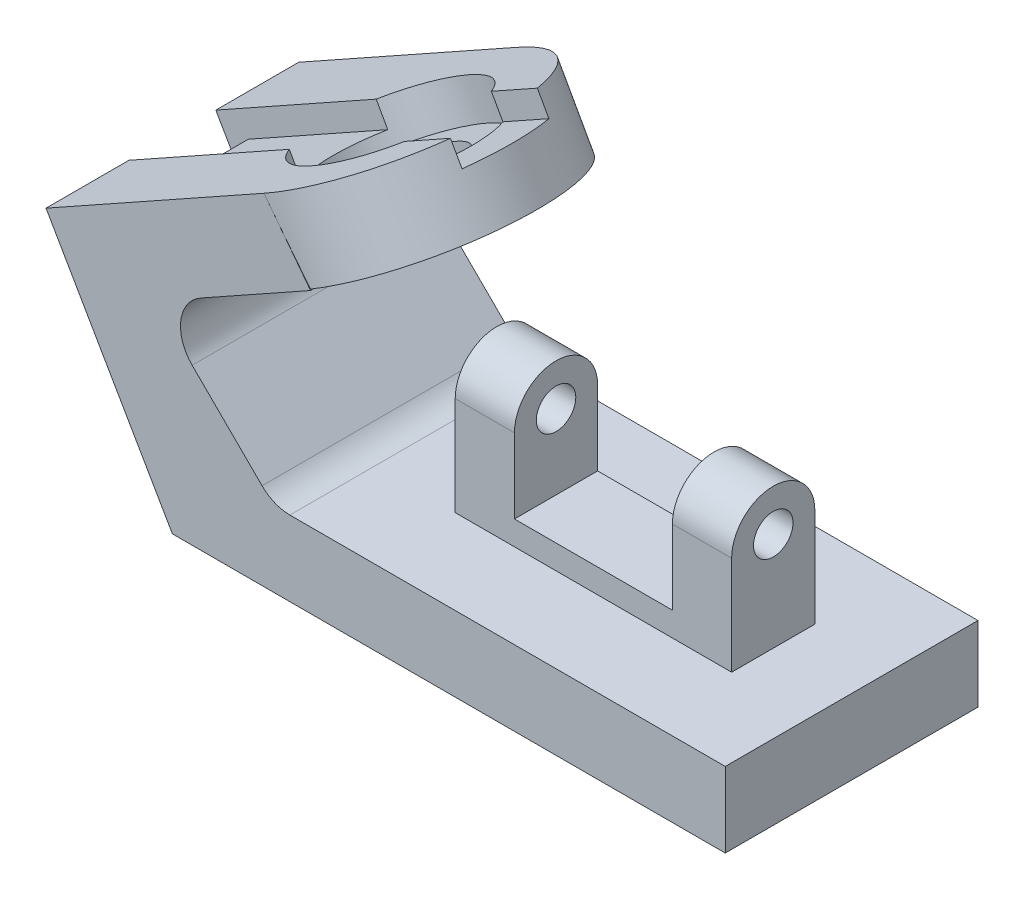
ISO-10303-21;
HEADER;
FILE_DESCRIPTION(('STEP AP214'),'2;1');
FILE_NAME('part.step','',(''),(''),'','','');
FILE_SCHEMA(('AUTOMOTIVE_DESIGN { 1 0 10303 214 1 1 1 1 }'));
ENDSEC;
DATA;
#1=APPLICATION_CONTEXT('core data for automotive mechanical design processes');
#2=APPLICATION_PROTOCOL_DEFINITION('international standard','automotive_design',2000,#1);
#3=PRODUCT_CONTEXT('',#1,'mechanical');
#4=PRODUCT('Part','Part','',(#3));
#5=PRODUCT_RELATED_PRODUCT_CATEGORY('part','',(#4));
#6=PRODUCT_DEFINITION_FORMATION('','',#4);
#7=PRODUCT_DEFINITION_CONTEXT('part definition',#1,'design');
#8=PRODUCT_DEFINITION('design','',#6,#7);
#9=PRODUCT_DEFINITION_SHAPE('','',#8);
#10=(LENGTH_UNIT() NAMED_UNIT(*) SI_UNIT(.MILLI.,.METRE.));
#11=(NAMED_UNIT(*) PLANE_ANGLE_UNIT() SI_UNIT($,.RADIAN.));
#12=(NAMED_UNIT(*) SI_UNIT($,.STERADIAN.) SOLID_ANGLE_UNIT());
#13=UNCERTAINTY_MEASURE_WITH_UNIT(LENGTH_MEASURE(1.E-05),#10,'distance_accuracy_value','');
#14=(GEOMETRIC_REPRESENTATION_CONTEXT(3) GLOBAL_UNCERTAINTY_ASSIGNED_CONTEXT((#13)) GLOBAL_UNIT_ASSIGNED_CONTEXT((#10,
#11,#12)) REPRESENTATION_CONTEXT('',''));
#15=CARTESIAN_POINT('',(0.,0.,0.));
#16=DIRECTION('',(0.,0.,1.));
#17=DIRECTION('',(1.,0.,0.));
#18=AXIS2_PLACEMENT_3D('',#15,#16,#17);
#19=CARTESIAN_POINT('',(50.1525287476843,44.,0.));
#20=DIRECTION('',(1.,0.,0.));
#21=DIRECTION('',(0.,1.,0.));
#22=AXIS2_PLACEMENT_3D('',#19,#20,#21);
#23=CYLINDRICAL_SURFACE('',#22,10.5347427146737);
#24=DIRECTION('',(-1.,0.,0.));
#25=VECTOR('',#24,1.);
#26=CARTESIAN_POINT('',(50.1525287476843,44.,-10.5347427146737));
#27=LINE('',#26,#25);
#28=CARTESIAN_POINT('',(120.152528747684,44.,-10.5347427146737));
#29=VERTEX_POINT('',#28);
#30=CARTESIAN_POINT('',(105.152528747684,44.,-10.5347427146737));
#31=VERTEX_POINT('',#30);
#32=EDGE_CURVE('E290',#29,#31,#27,.T.);
#33=ORIENTED_EDGE('',*,*,#32,.T.);
#34=CARTESIAN_POINT('',(105.152528747684,44.,0.));
#35=DIRECTION('',(1.,0.,0.));
#36=DIRECTION('',(0.,1.,0.));
#37=AXIS2_PLACEMENT_3D('',#34,#35,#36);
#38=CIRCLE('',#37,10.5347427146737);
#39=CARTESIAN_POINT('',(105.152528747684,44.,10.5347427146737));
#40=VERTEX_POINT('',#39);
#41=EDGE_CURVE('E270',#31,#40,#38,.T.);
#42=ORIENTED_EDGE('',*,*,#41,.T.);
#43=DIRECTION('',(1.,0.,0.));
#44=VECTOR('',#43,1.);
#45=CARTESIAN_POINT('',(50.1525287476843,44.,10.5347427146737));
#46=LINE('',#45,#44);
#47=CARTESIAN_POINT('',(120.152528747684,44.,10.5347427146737));
#48=VERTEX_POINT('',#47);
#49=EDGE_CURVE('E293',#40,#48,#46,.T.);
#50=ORIENTED_EDGE('',*,*,#49,.T.);
#51=CARTESIAN_POINT('',(120.152528747684,44.,0.));
#52=DIRECTION('',(1.,0.,0.));
#53=DIRECTION('',(0.,0.,-1.));
#54=AXIS2_PLACEMENT_3D('',#51,#52,#53);
#55=CIRCLE('',#54,10.5347427146737);
#56=EDGE_CURVE('E281',#48,#29,#55,.F.);
#57=ORIENTED_EDGE('',*,*,#56,.T.);
#58=EDGE_LOOP('',(#33,#42,#50,#57));
#59=FACE_BOUND('',#58,.T.);
#60=ADVANCED_FACE('F43',(#59),#23,.T.);
#61=CARTESIAN_POINT('',(50.1525287476843,44.,0.));
#62=DIRECTION('',(1.,0.,0.));
#63=DIRECTION('',(0.,1.,0.));
#64=AXIS2_PLACEMENT_3D('',#61,#62,#63);
#65=CYLINDRICAL_SURFACE('',#64,5.);
#66=CARTESIAN_POINT('',(105.152528747684,44.,0.));
#67=DIRECTION('',(1.,0.,0.));
#68=DIRECTION('',(0.,1.,0.));
#69=AXIS2_PLACEMENT_3D('',#66,#67,#68);
#70=CIRCLE('',#69,5.);
#71=CARTESIAN_POINT('',(105.152528747684,49.,0.));
#72=VERTEX_POINT('',#71);
#73=EDGE_CURVE('E47',#72,#72,#70,.F.);
#74=ORIENTED_EDGE('',*,*,#73,.T.);
#75=EDGE_LOOP('',(#74));
#76=FACE_BOUND('',#75,.T.);
#77=CARTESIAN_POINT('',(120.152528747684,44.,0.));
#78=DIRECTION('',(1.,0.,0.));
#79=DIRECTION('',(0.,1.,0.));
#80=AXIS2_PLACEMENT_3D('',#77,#78,#79);
#81=CIRCLE('',#80,5.);
#82=CARTESIAN_POINT('',(120.152528747684,49.,0.));
#83=VERTEX_POINT('',#82);
#84=EDGE_CURVE('E277',#83,#83,#81,.T.);
#85=ORIENTED_EDGE('',*,*,#84,.T.);
#86=EDGE_LOOP('',(#85));
#87=FACE_BOUND('',#86,.T.);
#88=ADVANCED_FACE('F496',(#76,#87),#65,.F.);
#89=CARTESIAN_POINT('',(140.,19.,32.));
#90=DIRECTION('',(0.,-1.,0.));
#91=DIRECTION('',(1.,0.,0.));
#92=AXIS2_PLACEMENT_3D('',#89,#90,#91);
#93=PLANE('',#92);
#94=DIRECTION('',(-1.,0.,0.));
#95=VECTOR('',#94,1.);
#96=CARTESIAN_POINT('',(140.,19.,-32.));
#97=LINE('',#96,#95);
#98=CARTESIAN_POINT('',(140.,19.,-32.));
#99=VERTEX_POINT('',#98);
#100=CARTESIAN_POINT('',(29.7490551983937,19.,-32.));
#101=VERTEX_POINT('',#100);
#102=EDGE_CURVE('E417',#99,#101,#97,.T.);
#103=ORIENTED_EDGE('',*,*,#102,.T.);
#104=DIRECTION('',(0.,0.,-1.));
#105=VECTOR('',#104,1.);
#106=CARTESIAN_POINT('',(29.7490551983937,19.,32.));
#107=LINE('',#106,#105);
#108=CARTESIAN_POINT('',(29.7490551983937,19.,32.));
#109=VERTEX_POINT('',#108);
#110=EDGE_CURVE('E458',#101,#109,#107,.F.);
#111=ORIENTED_EDGE('',*,*,#110,.T.);
#112=DIRECTION('',(-1.,0.,0.));
#113=VECTOR('',#112,1.);
#114=CARTESIAN_POINT('',(140.,19.,32.));
#115=LINE('',#114,#113);
#116=CARTESIAN_POINT('',(140.,19.,32.));
#117=VERTEX_POINT('',#116);
#118=EDGE_CURVE('E397',#117,#109,#115,.T.);
#119=ORIENTED_EDGE('',*,*,#118,.F.);
#120=DIRECTION('',(0.,0.,-1.));
#121=VECTOR('',#120,1.);
#122=CARTESIAN_POINT('',(140.,19.,32.));
#123=LINE('',#122,#121);
#124=EDGE_CURVE('E435',#117,#99,#123,.T.);
#125=ORIENTED_EDGE('',*,*,#124,.T.);
#126=EDGE_LOOP('',(#103,#111,#119,#125));
#127=FACE_BOUND('',#126,.T.);
#128=DIRECTION('',(0.,0.,-1.));
#129=VECTOR('',#128,1.);
#130=CARTESIAN_POINT('',(120.152528747684,19.,-10.5347427146737));
#131=LINE('',#130,#129);
#132=CARTESIAN_POINT('',(120.152528747684,19.,10.5347427146737));
#133=VERTEX_POINT('',#132);
#134=CARTESIAN_POINT('',(120.152528747684,19.,-10.5347427146738));
#135=VERTEX_POINT('',#134);
#136=EDGE_CURVE('E287',#133,#135,#131,.T.);
#137=ORIENTED_EDGE('',*,*,#136,.F.);
#138=DIRECTION('',(1.,0.,0.));
#139=VECTOR('',#138,1.);
#140=CARTESIAN_POINT('',(50.1525287476843,19.,10.5347427146737));
#141=LINE('',#140,#139);
#142=CARTESIAN_POINT('',(50.1525287476843,19.,10.5347427146737));
#143=VERTEX_POINT('',#142);
#144=EDGE_CURVE('E304',#143,#133,#141,.T.);
#145=ORIENTED_EDGE('',*,*,#144,.F.);
#146=DIRECTION('',(0.,0.,1.));
#147=VECTOR('',#146,1.);
#148=CARTESIAN_POINT('',(50.1525287476843,19.,-10.5347427146737));
#149=LINE('',#148,#147);
#150=CARTESIAN_POINT('',(50.1525287476843,19.,-10.5347427146737));
#151=VERTEX_POINT('',#150);
#152=EDGE_CURVE('E301',#151,#143,#149,.T.);
#153=ORIENTED_EDGE('',*,*,#152,.F.);
#154=DIRECTION('',(-1.,0.,0.));
#155=VECTOR('',#154,1.);
#156=CARTESIAN_POINT('',(50.1525287476843,19.,-10.5347427146737));
#157=LINE('',#156,#155);
#158=EDGE_CURVE('E68',#135,#151,#157,.T.);
#159=ORIENTED_EDGE('',*,*,#158,.F.);
#160=EDGE_LOOP('',(#137,#145,#153,#159));
#161=FACE_BOUND('',#160,.T.);
#162=ADVANCED_FACE('F504',(#127,#161),#93,.F.);
#163=CARTESIAN_POINT('',(-28.304842431579,50.6175511046577,0.));
#164=DIRECTION('',(0.488065264568901,-0.872807136497685,0.));
#165=DIRECTION('',(0.872807136497685,0.488065264568901,0.));
#166=AXIS2_PLACEMENT_3D('',#163,#164,#165);
#167=PLANE('',#166);
#168=DIRECTION('',(0.,0.,-1.));
#169=VECTOR('',#168,1.);
#170=CARTESIAN_POINT('',(-23.7623810745363,53.1576513299094,0.));
#171=LINE('',#170,#169);
#172=CARTESIAN_POINT('',(-23.7623810745363,53.1576513299093,11.));
#173=VERTEX_POINT('',#172);
#174=CARTESIAN_POINT('',(-23.7623810745363,53.1576513299094,-11.));
#175=VERTEX_POINT('',#174);
#176=EDGE_CURVE('E11',#173,#175,#171,.T.);
#177=ORIENTED_EDGE('',*,*,#176,.F.);
#178=DIRECTION('',(0.872807136497685,0.488065264568901,0.));
#179=VECTOR('',#178,1.);
#180=CARTESIAN_POINT('',(-37.6646460863985,45.383639904718,11.0000000000001));
#181=LINE('',#180,#179);
#182=CARTESIAN_POINT('',(11.543648181709,72.9004396152712,11.));
#183=VERTEX_POINT('',#182);
#184=EDGE_CURVE('E342',#173,#183,#181,.T.);
#185=ORIENTED_EDGE('',*,*,#184,.T.);
#186=CARTESIAN_POINT('',(26.1224015923556,81.0527367756769,0.));
#187=DIRECTION('',(0.488065264568901,-0.872807136497685,0.));
#188=DIRECTION('',(0.872807136497685,0.488065264568901,0.));
#189=AXIS2_PLACEMENT_3D('',#186,#187,#188);
#190=CIRCLE('',#189,20.);
#191=CARTESIAN_POINT('',(11.543648181709,72.9004396152712,-11.));
#192=VERTEX_POINT('',#191);
#193=EDGE_CURVE('E470',#192,#183,#190,.F.);
#194=ORIENTED_EDGE('',*,*,#193,.F.);
#195=DIRECTION('',(-0.872807136497685,-0.488065264568901,0.));
#196=VECTOR('',#195,1.);
#197=CARTESIAN_POINT('',(-37.6646460863986,45.383639904718,-11.));
#198=LINE('',#197,#196);
#199=EDGE_CURVE('E334',#192,#175,#198,.T.);
#200=ORIENTED_EDGE('',*,*,#199,.T.);
#201=EDGE_LOOP('',(#177,#185,#194,#200));
#202=FACE_BOUND('',#201,.T.);
#203=ADVANCED_FACE('F547',(#202),#167,.F.);
#204=CARTESIAN_POINT('',(-32.0000000000003,55.4256258422039,32.));
#205=DIRECTION('',(0.4880652645689,-0.872807136497685,0.));
#206=DIRECTION('',(0.872807136497685,0.488065264568901,0.));
#207=AXIS2_PLACEMENT_3D('',#204,#205,#206);
#208=PLANE('',#207);
#209=CARTESIAN_POINT('',(23.1940100049422,86.2895795946631,0.));
#210=DIRECTION('',(-0.488065264568901,0.872807136497685,0.));
#211=DIRECTION('',(-0.872807136497685,-0.488065264568901,0.));
#212=AXIS2_PLACEMENT_3D('',#209,#210,#211);
#213=CIRCLE('',#212,32.);
#214=CARTESIAN_POINT('',(49.4218281502192,100.955920492729,11.));
#215=VERTEX_POINT('',#214);
#216=CARTESIAN_POINT('',(23.1940100049422,86.2895795946631,32.));
#217=VERTEX_POINT('',#216);
#218=EDGE_CURVE('E372',#215,#217,#213,.F.);
#219=ORIENTED_EDGE('',*,*,#218,.F.);
#220=DIRECTION('',(0.872807136497685,0.488065264568901,0.));
#221=VECTOR('',#220,1.);
#222=CARTESIAN_POINT('',(-40.593037673812,50.6204827237041,11.0000000000001));
#223=LINE('',#222,#221);
#224=CARTESIAN_POINT('',(37.7727634155887,94.4418767550689,11.));
#225=VERTEX_POINT('',#224);
#226=EDGE_CURVE('E345',#225,#215,#223,.T.);
#227=ORIENTED_EDGE('',*,*,#226,.F.);
#228=CARTESIAN_POINT('',(23.1940100049422,86.289579594663,0.));
#229=DIRECTION('',(-0.488065264568901,0.872807136497685,0.));
#230=DIRECTION('',(-0.872807136497685,-0.488065264568901,0.));
#231=AXIS2_PLACEMENT_3D('',#228,#229,#230);
#232=CIRCLE('',#231,20.);
#233=CARTESIAN_POINT('',(8.61525659429559,78.1372824342573,11.));
#234=VERTEX_POINT('',#233);
#235=EDGE_CURVE('E366',#234,#225,#232,.T.);
#236=ORIENTED_EDGE('',*,*,#235,.F.);
#237=CARTESIAN_POINT('',(-32.0000000000003,55.4256258422039,11.));
#238=VERTEX_POINT('',#237);
#239=EDGE_CURVE('E338',#238,#234,#223,.T.);
#240=ORIENTED_EDGE('',*,*,#239,.F.);
#241=DIRECTION('',(0.,0.,-1.));
#242=VECTOR('',#241,1.);
#243=CARTESIAN_POINT('',(-32.0000000000003,55.4256258422039,32.));
#244=LINE('',#243,#242);
#245=CARTESIAN_POINT('',(-32.0000000000003,55.4256258422039,32.));
#246=VERTEX_POINT('',#245);
#247=EDGE_CURVE('E429',#246,#238,#244,.T.);
#248=ORIENTED_EDGE('',*,*,#247,.F.);
#249=DIRECTION('',(-0.872807136497685,-0.4880652645689,0.));
#250=VECTOR('',#249,1.);
#251=CARTESIAN_POINT('',(-32.0000000000003,55.4256258422039,32.));
#252=LINE('',#251,#250);
#253=EDGE_CURVE('E407',#217,#246,#252,.T.);
#254=ORIENTED_EDGE('',*,*,#253,.F.);
#255=EDGE_LOOP('',(#219,#227,#236,#240,#248,#254));
#256=FACE_BOUND('',#255,.T.);
#257=ADVANCED_FACE('F550',(#256),#208,.F.);
#258=CARTESIAN_POINT('',(32.4672500317513,69.706244001207,0.));
#259=DIRECTION('',(-0.488065264568901,0.872807136497685,0.));
#260=DIRECTION('',(-0.872807136497685,-0.488065264568901,0.));
#261=AXIS2_PLACEMENT_3D('',#258,#259,#260);
#262=CYLINDRICAL_SURFACE('',#261,12.);
#263=CARTESIAN_POINT('',(32.4672500317513,69.706244001207,0.));
#264=DIRECTION('',(-0.488065264568901,0.872807136497685,0.));
#265=DIRECTION('',(-0.872807136497685,-0.488065264568901,0.));
#266=AXIS2_PLACEMENT_3D('',#263,#264,#265);
#267=CIRCLE('',#266,12.);
#268=CARTESIAN_POINT('',(34.8494460372164,71.0383448457621,11.6854888443523));
#269=VERTEX_POINT('',#268);
#270=CARTESIAN_POINT('',(34.8494460372164,71.0383448457621,-11.6854888443523));
#271=VERTEX_POINT('',#270);
#272=EDGE_CURVE('E369',#269,#271,#267,.T.);
#273=ORIENTED_EDGE('',*,*,#272,.F.);
#274=EDGE_CURVE('E373',#271,#269,#267,.T.);
#275=ORIENTED_EDGE('',*,*,#274,.F.);
#276=EDGE_LOOP('',(#273,#275));
#277=FACE_BOUND('',#276,.T.);
#278=CARTESIAN_POINT('',(27.8306300183467,77.997911797935,0.));
#279=DIRECTION('',(-0.488065264568901,0.872807136497685,0.));
#280=DIRECTION('',(-0.872807136497685,-0.488065264568901,0.));
#281=AXIS2_PLACEMENT_3D('',#278,#279,#280);
#282=CIRCLE('',#281,12.);
#283=CARTESIAN_POINT('',(17.3569443803745,72.1411286231082,0.));
#284=VERTEX_POINT('',#283);
#285=EDGE_CURVE('E365',#284,#284,#282,.F.);
#286=ORIENTED_EDGE('',*,*,#285,.F.);
#287=EDGE_LOOP('',(#286));
#288=FACE_BOUND('',#287,.T.);
#289=ADVANCED_FACE('F575',(#277,#288),#262,.F.);
#290=CARTESIAN_POINT('',(23.1940100049422,86.289579594663,32.));
#291=DIRECTION('',(-0.794540626011861,-0.607210995961602,0.));
#292=DIRECTION('',(0.607210995961602,-0.794540626011861,0.));
#293=AXIS2_PLACEMENT_3D('',#290,#291,#292);
#294=PLANE('',#293);
#295=CARTESIAN_POINT('',(23.1940100049422,86.2895795946631,0.));
#296=DIRECTION('',(-0.794540626011861,-0.607210995961602,0.));
#297=DIRECTION('',(-0.607210995961602,0.794540626011861,0.));
#298=AXIS2_PLACEMENT_3D('',#295,#296,#297);
#299=ELLIPSE('',#298,225.050339522021,32.);
#300=CARTESIAN_POINT('',(34.8494460372164,71.0383448457621,31.8833914371022));
#301=VERTEX_POINT('',#300);
#302=EDGE_CURVE('E388',#217,#301,#299,.F.);
#303=ORIENTED_EDGE('',*,*,#302,.F.);
#304=DIRECTION('',(-0.607210995961602,0.794540626011861,0.));
#305=VECTOR('',#304,1.);
#306=CARTESIAN_POINT('',(23.1940100049422,86.289579594663,32.));
#307=LINE('',#306,#305);
#308=CARTESIAN_POINT('',(34.9875744142358,70.8576027184342,32.));
#309=VERTEX_POINT('',#308);
#310=EDGE_CURVE('E404',#309,#217,#307,.T.);
#311=ORIENTED_EDGE('',*,*,#310,.F.);
#312=DIRECTION('',(0.,0.,-1.));
#313=VECTOR('',#312,1.);
#314=CARTESIAN_POINT('',(34.9875744142358,70.8576027184342,32.));
#315=LINE('',#314,#313);
#316=CARTESIAN_POINT('',(34.9875744142358,70.8576027184342,-32.));
#317=VERTEX_POINT('',#316);
#318=EDGE_CURVE('E432',#309,#317,#315,.T.);
#319=ORIENTED_EDGE('',*,*,#318,.T.);
#320=DIRECTION('',(-0.607210995961602,0.794540626011861,0.));
#321=VECTOR('',#320,1.);
#322=CARTESIAN_POINT('',(23.1940100049422,86.289579594663,-32.));
#323=LINE('',#322,#321);
#324=CARTESIAN_POINT('',(23.1940100049422,86.289579594663,-32.));
#325=VERTEX_POINT('',#324);
#326=EDGE_CURVE('E424',#317,#325,#323,.T.);
#327=ORIENTED_EDGE('',*,*,#326,.T.);
#328=CARTESIAN_POINT('',(34.8494460372164,71.0383448457621,-31.8833914371022));
#329=VERTEX_POINT('',#328);
#330=EDGE_CURVE('E384',#329,#325,#299,.F.);
#331=ORIENTED_EDGE('',*,*,#330,.F.);
#332=DIRECTION('',(0.,0.,-1.));
#333=VECTOR('',#332,1.);
#334=CARTESIAN_POINT('',(34.8494460372164,71.0383448457621,32.));
#335=LINE('',#334,#333);
#336=EDGE_CURVE('E377',#271,#329,#335,.T.);
#337=ORIENTED_EDGE('',*,*,#336,.F.);
#338=EDGE_CURVE('E385',#269,#271,#335,.T.);
#339=ORIENTED_EDGE('',*,*,#338,.F.);
#340=EDGE_CURVE('E381',#301,#269,#335,.T.);
#341=ORIENTED_EDGE('',*,*,#340,.F.);
#342=EDGE_LOOP('',(#303,#311,#319,#327,#331,#337,#339,#341));
#343=FACE_BOUND('',#342,.T.);
#344=ADVANCED_FACE('F578',(#343),#294,.F.);
#345=CARTESIAN_POINT('',(0.,0.,32.));
#346=DIRECTION('',(0.866025403784436,0.500000000000004,0.));
#347=DIRECTION('',(-0.500000000000004,0.866025403784436,0.));
#348=AXIS2_PLACEMENT_3D('',#345,#346,#347);
#349=PLANE('',#348);
#350=DIRECTION('',(0.500000000000004,-0.866025403784436,0.));
#351=VECTOR('',#350,1.);
#352=CARTESIAN_POINT('',(0.,0.,11.));
#353=LINE('',#352,#351);
#354=CARTESIAN_POINT('',(-13.174099480216,22.8182096437007,11.));
#355=VERTEX_POINT('',#354);
#356=EDGE_CURVE('E359',#238,#355,#353,.T.);
#357=ORIENTED_EDGE('',*,*,#356,.T.);
#358=DIRECTION('',(0.,0.,1.));
#359=VECTOR('',#358,1.);
#360=CARTESIAN_POINT('',(-13.174099480216,22.8182096437007,-11.));
#361=LINE('',#360,#359);
#362=CARTESIAN_POINT('',(-13.174099480216,22.8182096437007,-11.));
#363=VERTEX_POINT('',#362);
#364=EDGE_CURVE('E317',#363,#355,#361,.T.);
#365=ORIENTED_EDGE('',*,*,#364,.F.);
#366=DIRECTION('',(-0.500000000000004,0.866025403784436,0.));
#367=VECTOR('',#366,1.);
#368=CARTESIAN_POINT('',(0.,0.,-11.));
#369=LINE('',#368,#367);
#370=CARTESIAN_POINT('',(-32.0000000000003,55.425625842204,-11.));
#371=VERTEX_POINT('',#370);
#372=EDGE_CURVE('E353',#363,#371,#369,.T.);
#373=ORIENTED_EDGE('',*,*,#372,.T.);
#374=CARTESIAN_POINT('',(-32.0000000000003,55.4256258422039,-32.));
#375=VERTEX_POINT('',#374);
#376=EDGE_CURVE('E409',#371,#375,#244,.T.);
#377=ORIENTED_EDGE('',*,*,#376,.T.);
#378=DIRECTION('',(0.500000000000004,-0.866025403784436,0.));
#379=VECTOR('',#378,1.);
#380=CARTESIAN_POINT('',(0.,0.,-32.));
#381=LINE('',#380,#379);
#382=CARTESIAN_POINT('',(0.,0.,-32.));
#383=VERTEX_POINT('',#382);
#384=EDGE_CURVE('E410',#375,#383,#381,.T.);
#385=ORIENTED_EDGE('',*,*,#384,.T.);
#386=DIRECTION('',(0.,0.,-1.));
#387=VECTOR('',#386,1.);
#388=CARTESIAN_POINT('',(0.,0.,32.));
#389=LINE('',#388,#387);
#390=CARTESIAN_POINT('',(0.,0.,32.));
#391=VERTEX_POINT('',#390);
#392=EDGE_CURVE('E441',#391,#383,#389,.T.);
#393=ORIENTED_EDGE('',*,*,#392,.F.);
#394=DIRECTION('',(0.500000000000004,-0.866025403784436,0.));
#395=VECTOR('',#394,1.);
#396=CARTESIAN_POINT('',(0.,0.,32.));
#397=LINE('',#396,#395);
#398=EDGE_CURVE('E389',#246,#391,#397,.T.);
#399=ORIENTED_EDGE('',*,*,#398,.F.);
#400=ORIENTED_EDGE('',*,*,#247,.T.);
#401=EDGE_LOOP('',(#357,#365,#373,#377,#385,#393,#399,#400));
#402=FACE_BOUND('',#401,.T.);
#403=ADVANCED_FACE('F603',(#402),#349,.F.);
#404=CARTESIAN_POINT('',(0.,0.,32.));
#405=DIRECTION('',(0.,1.,0.));
#406=DIRECTION('',(0.,0.,1.));
#407=AXIS2_PLACEMENT_3D('',#404,#405,#406);
#408=PLANE('',#407);
#409=DIRECTION('',(1.,0.,0.));
#410=VECTOR('',#409,1.);
#411=CARTESIAN_POINT('',(0.,0.,-32.));
#412=LINE('',#411,#410);
#413=CARTESIAN_POINT('',(140.,0.,-32.));
#414=VERTEX_POINT('',#413);
#415=EDGE_CURVE('E413',#383,#414,#412,.T.);
#416=ORIENTED_EDGE('',*,*,#415,.T.);
#417=DIRECTION('',(0.,0.,-1.));
#418=VECTOR('',#417,1.);
#419=CARTESIAN_POINT('',(140.,0.,32.));
#420=LINE('',#419,#418);
#421=CARTESIAN_POINT('',(140.,0.,32.));
#422=VERTEX_POINT('',#421);
#423=EDGE_CURVE('E438',#422,#414,#420,.T.);
#424=ORIENTED_EDGE('',*,*,#423,.F.);
#425=DIRECTION('',(1.,0.,0.));
#426=VECTOR('',#425,1.);
#427=CARTESIAN_POINT('',(0.,0.,32.));
#428=LINE('',#427,#426);
#429=EDGE_CURVE('E392',#391,#422,#428,.T.);
#430=ORIENTED_EDGE('',*,*,#429,.F.);
#431=ORIENTED_EDGE('',*,*,#392,.T.);
#432=EDGE_LOOP('',(#416,#424,#430,#431));
#433=FACE_BOUND('',#432,.T.);
#434=ADVANCED_FACE('F617',(#433),#408,.F.);
#435=CARTESIAN_POINT('',(140.,0.,32.));
#436=DIRECTION('',(-1.,0.,0.));
#437=DIRECTION('',(0.,0.,1.));
#438=AXIS2_PLACEMENT_3D('',#435,#436,#437);
#439=PLANE('',#438);
#440=DIRECTION('',(0.,1.,0.));
#441=VECTOR('',#440,1.);
#442=CARTESIAN_POINT('',(140.,0.,-32.));
#443=LINE('',#442,#441);
#444=EDGE_CURVE('E415',#414,#99,#443,.T.);
#445=ORIENTED_EDGE('',*,*,#444,.T.);
#446=ORIENTED_EDGE('',*,*,#124,.F.);
#447=DIRECTION('',(0.,1.,0.));
#448=VECTOR('',#447,1.);
#449=CARTESIAN_POINT('',(140.,0.,32.));
#450=LINE('',#449,#448);
#451=EDGE_CURVE('E395',#422,#117,#450,.T.);
#452=ORIENTED_EDGE('',*,*,#451,.F.);
#453=ORIENTED_EDGE('',*,*,#423,.T.);
#454=EDGE_LOOP('',(#445,#446,#452,#453));
#455=FACE_BOUND('',#454,.T.);
#456=ADVANCED_FACE('F611',(#455),#439,.F.);
#457=CARTESIAN_POINT('',(-4.40299499752864,48.8307792914199,32.));
#458=DIRECTION('',(-0.704757477755356,-0.70944830505676,0.));
#459=DIRECTION('',(0.70944830505676,-0.704757477755356,0.));
#460=AXIS2_PLACEMENT_3D('',#457,#458,#459);
#461=PLANE('',#460);
#462=DIRECTION('',(-0.70944830505676,0.704757477755356,0.));
#463=VECTOR('',#462,1.);
#464=CARTESIAN_POINT('',(-4.40299499752864,48.8307792914199,32.));
#465=LINE('',#464,#463);
#466=CARTESIAN_POINT('',(22.7014804208401,21.9055169494324,32.));
#467=VERTEX_POINT('',#466);
#468=CARTESIAN_POINT('',(5.00769446493375,39.4823127122048,32.));
#469=VERTEX_POINT('',#468);
#470=EDGE_CURVE('E400',#467,#469,#465,.T.);
#471=ORIENTED_EDGE('',*,*,#470,.F.);
#472=DIRECTION('',(0.,0.,-1.));
#473=VECTOR('',#472,1.);
#474=CARTESIAN_POINT('',(22.7014804208401,21.9055169494324,-32.));
#475=LINE('',#474,#473);
#476=CARTESIAN_POINT('',(22.7014804208401,21.9055169494324,-32.));
#477=VERTEX_POINT('',#476);
#478=EDGE_CURVE('E455',#467,#477,#475,.T.);
#479=ORIENTED_EDGE('',*,*,#478,.T.);
#480=DIRECTION('',(-0.70944830505676,0.704757477755356,0.));
#481=VECTOR('',#480,1.);
#482=CARTESIAN_POINT('',(-4.40299499752864,48.8307792914199,-32.));
#483=LINE('',#482,#481);
#484=CARTESIAN_POINT('',(5.00769446493375,39.4823127122048,-32.));
#485=VERTEX_POINT('',#484);
#486=EDGE_CURVE('E420',#477,#485,#483,.T.);
#487=ORIENTED_EDGE('',*,*,#486,.T.);
#488=DIRECTION('',(0.,0.,-1.));
#489=VECTOR('',#488,1.);
#490=CARTESIAN_POINT('',(5.00769446493375,39.4823127122048,32.));
#491=LINE('',#490,#489);
#492=EDGE_CURVE('E447',#485,#469,#491,.F.);
#493=ORIENTED_EDGE('',*,*,#492,.T.);
#494=EDGE_LOOP('',(#471,#479,#487,#493));
#495=FACE_BOUND('',#494,.T.);
#496=ADVANCED_FACE('F607',(#495),#461,.F.);
#497=CARTESIAN_POINT('',(34.9875744142358,70.8576027184342,32.));
#498=DIRECTION('',(-0.488065264568901,0.872807136497685,0.));
#499=DIRECTION('',(-0.872807136497685,-0.488065264568901,0.));
#500=AXIS2_PLACEMENT_3D('',#497,#498,#499);
#501=PLANE('',#500);
#502=DIRECTION('',(0.872807136497685,0.488065264568901,0.));
#503=VECTOR('',#502,1.);
#504=CARTESIAN_POINT('',(34.9875744142358,70.8576027184342,32.));
#505=LINE('',#504,#503);
#506=CARTESIAN_POINT('',(7.17461659679829,55.3048671277492,32.));
#507=VERTEX_POINT('',#506);
#508=EDGE_CURVE('E402',#507,#309,#505,.T.);
#509=ORIENTED_EDGE('',*,*,#508,.F.);
#510=DIRECTION('',(0.,0.,-1.));
#511=VECTOR('',#510,1.);
#512=CARTESIAN_POINT('',(7.17461659679829,55.3048671277492,-32.));
#513=LINE('',#512,#511);
#514=CARTESIAN_POINT('',(7.17461659679829,55.3048671277492,-32.));
#515=VERTEX_POINT('',#514);
#516=EDGE_CURVE('E444',#507,#515,#513,.T.);
#517=ORIENTED_EDGE('',*,*,#516,.T.);
#518=DIRECTION('',(0.872807136497685,0.488065264568901,0.));
#519=VECTOR('',#518,1.);
#520=CARTESIAN_POINT('',(34.9875744142358,70.8576027184342,-32.));
#521=LINE('',#520,#519);
#522=EDGE_CURVE('E422',#515,#317,#521,.T.);
#523=ORIENTED_EDGE('',*,*,#522,.T.);
#524=ORIENTED_EDGE('',*,*,#318,.F.);
#525=EDGE_LOOP('',(#509,#517,#523,#524));
#526=FACE_BOUND('',#525,.T.);
#527=ADVANCED_FACE('F599',(#526),#501,.F.);
#528=ORIENTED_EDGE('',*,*,#376,.F.);
#529=DIRECTION('',(-0.872807136497685,-0.488065264568901,0.));
#530=VECTOR('',#529,1.);
#531=CARTESIAN_POINT('',(-40.593037673812,50.6204827237041,-11.));
#532=LINE('',#531,#530);
#533=CARTESIAN_POINT('',(8.61525659429557,78.1372824342573,-11.));
#534=VERTEX_POINT('',#533);
#535=EDGE_CURVE('E331',#534,#371,#532,.T.);
#536=ORIENTED_EDGE('',*,*,#535,.F.);
#537=CARTESIAN_POINT('',(37.7727634155888,94.4418767550689,-11.));
#538=VERTEX_POINT('',#537);
#539=EDGE_CURVE('E361',#538,#534,#232,.T.);
#540=ORIENTED_EDGE('',*,*,#539,.F.);
#541=CARTESIAN_POINT('',(49.4218281502192,100.955920492729,-11.));
#542=VERTEX_POINT('',#541);
#543=EDGE_CURVE('E344',#542,#538,#532,.T.);
#544=ORIENTED_EDGE('',*,*,#543,.F.);
#545=EDGE_CURVE('E378',#325,#542,#213,.F.);
#546=ORIENTED_EDGE('',*,*,#545,.F.);
#547=DIRECTION('',(-0.872807136497685,-0.4880652645689,0.));
#548=VECTOR('',#547,1.);
#549=CARTESIAN_POINT('',(-32.0000000000003,55.4256258422039,-32.));
#550=LINE('',#549,#548);
#551=EDGE_CURVE('E393',#325,#375,#550,.T.);
#552=ORIENTED_EDGE('',*,*,#551,.T.);
#553=EDGE_LOOP('',(#528,#536,#540,#544,#546,#552));
#554=FACE_BOUND('',#553,.T.);
#555=ADVANCED_FACE('F591',(#554),#208,.F.);
#556=CARTESIAN_POINT('',(0.,0.,32.));
#557=DIRECTION('',(0.,0.,-1.));
#558=DIRECTION('',(-1.,0.,0.));
#559=AXIS2_PLACEMENT_3D('',#556,#557,#558);
#560=PLANE('',#559);
#561=ORIENTED_EDGE('',*,*,#398,.T.);
#562=ORIENTED_EDGE('',*,*,#429,.T.);
#563=ORIENTED_EDGE('',*,*,#451,.T.);
#564=ORIENTED_EDGE('',*,*,#118,.T.);
#565=CARTESIAN_POINT('',(29.7490551983937,29.,32.));
#566=DIRECTION('',(0.,0.,-1.));
#567=DIRECTION('',(-1.,0.,0.));
#568=AXIS2_PLACEMENT_3D('',#565,#566,#567);
#569=CIRCLE('',#568,10.);
#570=EDGE_CURVE('E462',#109,#467,#569,.T.);
#571=ORIENTED_EDGE('',*,*,#570,.T.);
#572=ORIENTED_EDGE('',*,*,#470,.T.);
#573=CARTESIAN_POINT('',(12.0552692424873,46.5767957627724,32.));
#574=DIRECTION('',(0.,0.,-1.));
#575=DIRECTION('',(-1.,0.,0.));
#576=AXIS2_PLACEMENT_3D('',#573,#574,#575);
#577=CIRCLE('',#576,10.);
#578=EDGE_CURVE('E453',#469,#507,#577,.T.);
#579=ORIENTED_EDGE('',*,*,#578,.T.);
#580=ORIENTED_EDGE('',*,*,#508,.T.);
#581=ORIENTED_EDGE('',*,*,#310,.T.);
#582=ORIENTED_EDGE('',*,*,#253,.T.);
#583=EDGE_LOOP('',(#561,#562,#563,#564,#571,#572,#579,#580,#581,#582));
#584=FACE_BOUND('',#583,.T.);
#585=ADVANCED_FACE('F587',(#584),#560,.F.);
#586=CARTESIAN_POINT('',(0.,0.,-32.));
#587=DIRECTION('',(0.,0.,-1.));
#588=DIRECTION('',(-1.,0.,0.));
#589=AXIS2_PLACEMENT_3D('',#586,#587,#588);
#590=PLANE('',#589);
#591=ORIENTED_EDGE('',*,*,#384,.F.);
#592=ORIENTED_EDGE('',*,*,#551,.F.);
#593=ORIENTED_EDGE('',*,*,#326,.F.);
#594=ORIENTED_EDGE('',*,*,#522,.F.);
#595=CARTESIAN_POINT('',(12.0552692424873,46.5767957627724,-32.));
#596=DIRECTION('',(0.,0.,-1.));
#597=DIRECTION('',(-1.,0.,0.));
#598=AXIS2_PLACEMENT_3D('',#595,#596,#597);
#599=CIRCLE('',#598,10.);
#600=EDGE_CURVE('E450',#515,#485,#599,.F.);
#601=ORIENTED_EDGE('',*,*,#600,.T.);
#602=ORIENTED_EDGE('',*,*,#486,.F.);
#603=CARTESIAN_POINT('',(29.7490551983937,29.,-32.));
#604=DIRECTION('',(0.,0.,-1.));
#605=DIRECTION('',(-1.,0.,0.));
#606=AXIS2_PLACEMENT_3D('',#603,#604,#605);
#607=CIRCLE('',#606,10.);
#608=EDGE_CURVE('E460',#477,#101,#607,.F.);
#609=ORIENTED_EDGE('',*,*,#608,.T.);
#610=ORIENTED_EDGE('',*,*,#102,.F.);
#611=ORIENTED_EDGE('',*,*,#444,.F.);
#612=ORIENTED_EDGE('',*,*,#415,.F.);
#613=EDGE_LOOP('',(#591,#592,#593,#594,#601,#602,#609,#610,#611,#612));
#614=FACE_BOUND('',#613,.T.);
#615=ADVANCED_FACE('F590',(#614),#590,.T.);
#616=CARTESIAN_POINT('',(12.0552692424873,46.5767957627724,32.));
#617=DIRECTION('',(0.,0.,1.));
#618=DIRECTION('',(1.,0.,0.));
#619=AXIS2_PLACEMENT_3D('',#616,#617,#618);
#620=CYLINDRICAL_SURFACE('',#619,10.);
#621=ORIENTED_EDGE('',*,*,#578,.F.);
#622=ORIENTED_EDGE('',*,*,#492,.F.);
#623=ORIENTED_EDGE('',*,*,#600,.F.);
#624=ORIENTED_EDGE('',*,*,#516,.F.);
#625=EDGE_LOOP('',(#621,#622,#623,#624));
#626=FACE_BOUND('',#625,.T.);
#627=ADVANCED_FACE('F595',(#626),#620,.F.);
#628=CARTESIAN_POINT('',(29.7490551983937,29.,32.));
#629=DIRECTION('',(0.,0.,1.));
#630=DIRECTION('',(1.,0.,0.));
#631=AXIS2_PLACEMENT_3D('',#628,#629,#630);
#632=CYLINDRICAL_SURFACE('',#631,10.);
#633=ORIENTED_EDGE('',*,*,#570,.F.);
#634=ORIENTED_EDGE('',*,*,#110,.F.);
#635=ORIENTED_EDGE('',*,*,#608,.F.);
#636=ORIENTED_EDGE('',*,*,#478,.F.);
#637=EDGE_LOOP('',(#633,#634,#635,#636));
#638=FACE_BOUND('',#637,.T.);
#639=ADVANCED_FACE('F45',(#638),#632,.F.);
#640=CARTESIAN_POINT('',(32.4672500317513,69.706244001207,0.));
#641=DIRECTION('',(-0.488065264568901,0.872807136497685,0.));
#642=DIRECTION('',(-0.872807136497685,-0.488065264568901,0.));
#643=AXIS2_PLACEMENT_3D('',#640,#641,#642);
#644=CYLINDRICAL_SURFACE('',#643,32.);
#645=CARTESIAN_POINT('',(26.1224015923556,81.052736775677,0.));
#646=DIRECTION('',(0.488065264568901,-0.872807136497685,0.));
#647=DIRECTION('',(0.872807136497685,0.488065264568901,0.));
#648=AXIS2_PLACEMENT_3D('',#645,#646,#647);
#649=CIRCLE('',#648,32.);
#650=CARTESIAN_POINT('',(52.3502197376326,95.7190776737427,-11.));
#651=VERTEX_POINT('',#650);
#652=CARTESIAN_POINT('',(52.3502197376326,95.7190776737427,11.));
#653=VERTEX_POINT('',#652);
#654=EDGE_CURVE('E347',#651,#653,#649,.T.);
#655=ORIENTED_EDGE('',*,*,#654,.T.);
#656=DIRECTION('',(-0.488065264568901,0.872807136497685,0.));
#657=VECTOR('',#656,1.);
#658=CARTESIAN_POINT('',(58.6950681770284,84.3725848992728,11.));
#659=LINE('',#658,#657);
#660=EDGE_CURVE('E356',#653,#215,#659,.T.);
#661=ORIENTED_EDGE('',*,*,#660,.T.);
#662=ORIENTED_EDGE('',*,*,#218,.T.);
#663=ORIENTED_EDGE('',*,*,#302,.T.);
#664=CARTESIAN_POINT('',(32.4672500317513,69.706244001207,0.));
#665=DIRECTION('',(-0.488065264568901,0.872807136497685,0.));
#666=DIRECTION('',(-0.872807136497685,-0.488065264568901,0.));
#667=AXIS2_PLACEMENT_3D('',#664,#665,#666);
#668=CIRCLE('',#667,32.);
#669=EDGE_CURVE('E374',#329,#301,#668,.F.);
#670=ORIENTED_EDGE('',*,*,#669,.F.);
#671=ORIENTED_EDGE('',*,*,#330,.T.);
#672=ORIENTED_EDGE('',*,*,#545,.T.);
#673=DIRECTION('',(-0.488065264568901,0.872807136497685,0.));
#674=VECTOR('',#673,1.);
#675=CARTESIAN_POINT('',(58.6950681770284,84.3725848992728,-11.));
#676=LINE('',#675,#674);
#677=EDGE_CURVE('E350',#542,#651,#676,.F.);
#678=ORIENTED_EDGE('',*,*,#677,.T.);
#679=EDGE_LOOP('',(#655,#661,#662,#663,#670,#671,#672,#678));
#680=FACE_BOUND('',#679,.T.);
#681=ADVANCED_FACE('F582',(#680),#644,.T.);
#682=CARTESIAN_POINT('',(-21.9599939921832,39.2710583301877,0.));
#683=DIRECTION('',(-0.488065264568901,0.872807136497685,0.));
#684=DIRECTION('',(-0.872807136497685,-0.488065264568901,0.));
#685=AXIS2_PLACEMENT_3D('',#682,#683,#684);
#686=PLANE('',#685);
#687=ORIENTED_EDGE('',*,*,#340,.T.);
#688=ORIENTED_EDGE('',*,*,#272,.T.);
#689=ORIENTED_EDGE('',*,*,#336,.T.);
#690=ORIENTED_EDGE('',*,*,#669,.T.);
#691=EDGE_LOOP('',(#687,#688,#689,#690));
#692=FACE_BOUND('',#691,.T.);
#693=ADVANCED_FACE('F573',(#692),#686,.F.);
#694=CARTESIAN_POINT('',(32.4672500317513,69.706244001207,0.));
#695=DIRECTION('',(-0.488065264568901,0.872807136497685,0.));
#696=DIRECTION('',(-0.872807136497685,-0.488065264568901,0.));
#697=AXIS2_PLACEMENT_3D('',#694,#695,#696);
#698=PLANE('',#697);
#699=ORIENTED_EDGE('',*,*,#338,.T.);
#700=ORIENTED_EDGE('',*,*,#274,.T.);
#701=EDGE_LOOP('',(#699,#700));
#702=FACE_BOUND('',#701,.T.);
#703=ADVANCED_FACE('F566',(#702),#698,.T.);
#704=CARTESIAN_POINT('',(27.8306300183467,77.997911797935,0.));
#705=DIRECTION('',(-0.488065264568901,0.872807136497685,0.));
#706=DIRECTION('',(-0.872807136497685,-0.488065264568901,0.));
#707=AXIS2_PLACEMENT_3D('',#704,#705,#706);
#708=PLANE('',#707);
#709=CARTESIAN_POINT('',(27.8306300183467,77.997911797935,0.));
#710=DIRECTION('',(-0.488065264568901,0.872807136497685,0.));
#711=DIRECTION('',(-0.872807136497685,-0.488065264568901,0.));
#712=AXIS2_PLACEMENT_3D('',#709,#710,#711);
#713=CIRCLE('',#712,20.);
#714=CARTESIAN_POINT('',(10.374487288393,68.236606506557,0.));
#715=VERTEX_POINT('',#714);
#716=EDGE_CURVE('E362',#715,#715,#713,.T.);
#717=ORIENTED_EDGE('',*,*,#716,.T.);
#718=EDGE_LOOP('',(#717));
#719=FACE_BOUND('',#718,.T.);
#720=ORIENTED_EDGE('',*,*,#285,.T.);
#721=EDGE_LOOP('',(#720));
#722=FACE_BOUND('',#721,.T.);
#723=ADVANCED_FACE('F562',(#719,#722),#708,.T.);
#724=CARTESIAN_POINT('',(27.8306300183467,77.997911797935,0.));
#725=DIRECTION('',(-0.488065264568901,0.872807136497685,0.));
#726=DIRECTION('',(-0.872807136497685,-0.488065264568901,0.));
#727=AXIS2_PLACEMENT_3D('',#724,#725,#726);
#728=CYLINDRICAL_SURFACE('',#727,20.);
#729=ORIENTED_EDGE('',*,*,#193,.T.);
#730=DIRECTION('',(-0.488065264568901,0.872807136497685,0.));
#731=VECTOR('',#730,1.);
#732=CARTESIAN_POINT('',(13.2518766077002,69.8456146375292,11.));
#733=LINE('',#732,#731);
#734=EDGE_CURVE('E52',#183,#234,#733,.T.);
#735=ORIENTED_EDGE('',*,*,#734,.T.);
#736=ORIENTED_EDGE('',*,*,#235,.T.);
#737=DIRECTION('',(-0.488065264568901,0.872807136497685,0.));
#738=VECTOR('',#737,1.);
#739=CARTESIAN_POINT('',(42.4093834289933,86.1502089583408,11.));
#740=LINE('',#739,#738);
#741=CARTESIAN_POINT('',(40.7011550030022,89.2050339360827,11.));
#742=VERTEX_POINT('',#741);
#743=EDGE_CURVE('E473',#225,#742,#740,.F.);
#744=ORIENTED_EDGE('',*,*,#743,.T.);
#745=CARTESIAN_POINT('',(40.7011550030022,89.2050339360828,-11.));
#746=VERTEX_POINT('',#745);
#747=EDGE_CURVE('E464',#742,#746,#190,.F.);
#748=ORIENTED_EDGE('',*,*,#747,.T.);
#749=DIRECTION('',(-0.488065264568901,0.872807136497685,0.));
#750=VECTOR('',#749,1.);
#751=CARTESIAN_POINT('',(42.4093834289933,86.1502089583408,-11.));
#752=LINE('',#751,#750);
#753=EDGE_CURVE('E469',#746,#538,#752,.T.);
#754=ORIENTED_EDGE('',*,*,#753,.T.);
#755=ORIENTED_EDGE('',*,*,#539,.T.);
#756=DIRECTION('',(-0.488065264568901,0.872807136497685,0.));
#757=VECTOR('',#756,1.);
#758=CARTESIAN_POINT('',(13.2518766077001,69.8456146375292,-11.));
#759=LINE('',#758,#757);
#760=EDGE_CURVE('E476',#534,#192,#759,.F.);
#761=ORIENTED_EDGE('',*,*,#760,.T.);
#762=EDGE_LOOP('',(#729,#735,#736,#744,#748,#754,#755,#761));
#763=FACE_BOUND('',#762,.T.);
#764=ORIENTED_EDGE('',*,*,#716,.F.);
#765=EDGE_LOOP('',(#764));
#766=FACE_BOUND('',#765,.T.);
#767=ADVANCED_FACE('F565',(#763,#766),#728,.F.);
#768=EDGE_CURVE('E337',#651,#746,#198,.T.);
#769=ORIENTED_EDGE('',*,*,#768,.T.);
#770=ORIENTED_EDGE('',*,*,#747,.F.);
#771=EDGE_CURVE('E339',#742,#653,#181,.T.);
#772=ORIENTED_EDGE('',*,*,#771,.T.);
#773=ORIENTED_EDGE('',*,*,#654,.F.);
#774=EDGE_LOOP('',(#769,#770,#772,#773));
#775=FACE_BOUND('',#774,.T.);
#776=ADVANCED_FACE('F552',(#775),#167,.F.);
#777=CARTESIAN_POINT('',(-37.6646460863986,45.383639904718,-11.));
#778=DIRECTION('',(0.,0.,-1.));
#779=DIRECTION('',(-1.,0.,0.));
#780=AXIS2_PLACEMENT_3D('',#777,#778,#779);
#781=PLANE('',#780);
#782=ORIENTED_EDGE('',*,*,#543,.T.);
#783=ORIENTED_EDGE('',*,*,#753,.F.);
#784=ORIENTED_EDGE('',*,*,#768,.F.);
#785=ORIENTED_EDGE('',*,*,#677,.F.);
#786=EDGE_LOOP('',(#782,#783,#784,#785));
#787=FACE_BOUND('',#786,.T.);
#788=ADVANCED_FACE('F561',(#787),#781,.F.);
#789=CARTESIAN_POINT('',(-37.6646460863985,45.383639904718,11.0000000000001));
#790=DIRECTION('',(0.,0.,1.));
#791=DIRECTION('',(1.,0.,0.));
#792=AXIS2_PLACEMENT_3D('',#789,#790,#791);
#793=PLANE('',#792);
#794=ORIENTED_EDGE('',*,*,#771,.F.);
#795=ORIENTED_EDGE('',*,*,#743,.F.);
#796=ORIENTED_EDGE('',*,*,#226,.T.);
#797=ORIENTED_EDGE('',*,*,#660,.F.);
#798=EDGE_LOOP('',(#794,#795,#796,#797));
#799=FACE_BOUND('',#798,.T.);
#800=ADVANCED_FACE('F556',(#799),#793,.F.);
#801=ORIENTED_EDGE('',*,*,#239,.T.);
#802=ORIENTED_EDGE('',*,*,#734,.F.);
#803=ORIENTED_EDGE('',*,*,#184,.F.);
#804=DIRECTION('',(-0.500000000000004,0.866025403784436,0.));
#805=VECTOR('',#804,1.);
#806=CARTESIAN_POINT('',(-39.629182754389,80.6397579930331,11.));
#807=LINE('',#806,#805);
#808=CARTESIAN_POINT('',(-7.97794705750943,25.8182096437007,11.));
#809=VERTEX_POINT('',#808);
#810=EDGE_CURVE('E318',#809,#173,#807,.T.);
#811=ORIENTED_EDGE('',*,*,#810,.F.);
#812=DIRECTION('',(-0.866025403784436,-0.500000000000004,0.));
#813=VECTOR('',#812,1.);
#814=CARTESIAN_POINT('',(-7.97794705750943,25.8182096437007,11.));
#815=LINE('',#814,#813);
#816=EDGE_CURVE('E328',#809,#355,#815,.T.);
#817=ORIENTED_EDGE('',*,*,#816,.T.);
#818=ORIENTED_EDGE('',*,*,#356,.F.);
#819=EDGE_LOOP('',(#801,#802,#803,#811,#817,#818));
#820=FACE_BOUND('',#819,.T.);
#821=ADVANCED_FACE('F553',(#820),#793,.F.);
#822=ORIENTED_EDGE('',*,*,#372,.F.);
#823=DIRECTION('',(-0.866025403784436,-0.500000000000004,0.));
#824=VECTOR('',#823,1.);
#825=CARTESIAN_POINT('',(-7.97794705750943,25.8182096437007,-11.));
#826=LINE('',#825,#824);
#827=CARTESIAN_POINT('',(-7.97794705750943,25.8182096437007,-11.));
#828=VERTEX_POINT('',#827);
#829=EDGE_CURVE('E325',#828,#363,#826,.T.);
#830=ORIENTED_EDGE('',*,*,#829,.F.);
#831=DIRECTION('',(0.500000000000004,-0.866025403784436,0.));
#832=VECTOR('',#831,1.);
#833=CARTESIAN_POINT('',(-39.629182754389,80.6397579930331,-11.));
#834=LINE('',#833,#832);
#835=EDGE_CURVE('E320',#175,#828,#834,.T.);
#836=ORIENTED_EDGE('',*,*,#835,.F.);
#837=ORIENTED_EDGE('',*,*,#199,.F.);
#838=ORIENTED_EDGE('',*,*,#760,.F.);
#839=ORIENTED_EDGE('',*,*,#535,.T.);
#840=EDGE_LOOP('',(#822,#830,#836,#837,#838,#839));
#841=FACE_BOUND('',#840,.T.);
#842=ADVANCED_FACE('F544',(#841),#781,.F.);
#843=CARTESIAN_POINT('',(5.19615242270662,3.00000000000003,0.));
#844=DIRECTION('',(-0.866025403784436,-0.500000000000004,0.));
#845=DIRECTION('',(0.500000000000004,-0.866025403784436,0.));
#846=AXIS2_PLACEMENT_3D('',#843,#844,#845);
#847=PLANE('',#846);
#848=ORIENTED_EDGE('',*,*,#176,.T.);
#849=ORIENTED_EDGE('',*,*,#835,.T.);
#850=DIRECTION('',(0.,0.,1.));
#851=VECTOR('',#850,1.);
#852=CARTESIAN_POINT('',(-7.97794705750943,25.8182096437007,-11.));
#853=LINE('',#852,#851);
#854=EDGE_CURVE('E322',#828,#809,#853,.T.);
#855=ORIENTED_EDGE('',*,*,#854,.T.);
#856=ORIENTED_EDGE('',*,*,#810,.T.);
#857=EDGE_LOOP('',(#848,#849,#855,#856));
#858=FACE_BOUND('',#857,.T.);
#859=ADVANCED_FACE('F537',(#858),#847,.T.);
#860=CARTESIAN_POINT('',(-7.97794705750943,25.8182096437007,-11.));
#861=DIRECTION('',(0.500000000000004,-0.866025403784436,0.));
#862=DIRECTION('',(0.866025403784436,0.500000000000004,0.));
#863=AXIS2_PLACEMENT_3D('',#860,#861,#862);
#864=PLANE('',#863);
#865=ORIENTED_EDGE('',*,*,#364,.T.);
#866=ORIENTED_EDGE('',*,*,#816,.F.);
#867=ORIENTED_EDGE('',*,*,#854,.F.);
#868=ORIENTED_EDGE('',*,*,#829,.T.);
#869=EDGE_LOOP('',(#865,#866,#867,#868));
#870=FACE_BOUND('',#869,.T.);
#871=ADVANCED_FACE('F528',(#870),#864,.F.);
#872=CARTESIAN_POINT('',(120.152528747684,44.,-10.5347427146737));
#873=DIRECTION('',(-1.,0.,0.));
#874=DIRECTION('',(0.,-1.,0.));
#875=AXIS2_PLACEMENT_3D('',#872,#873,#874);
#876=PLANE('',#875);
#877=ORIENTED_EDGE('',*,*,#84,.F.);
#878=EDGE_LOOP('',(#877));
#879=FACE_BOUND('',#878,.T.);
#880=ORIENTED_EDGE('',*,*,#136,.T.);
#881=DIRECTION('',(0.,-1.,0.));
#882=VECTOR('',#881,1.);
#883=CARTESIAN_POINT('',(120.152528747684,44.,-10.5347427146737));
#884=LINE('',#883,#882);
#885=EDGE_CURVE('E315',#29,#135,#884,.T.);
#886=ORIENTED_EDGE('',*,*,#885,.F.);
#887=ORIENTED_EDGE('',*,*,#56,.F.);
#888=DIRECTION('',(0.,-1.,0.));
#889=VECTOR('',#888,1.);
#890=CARTESIAN_POINT('',(120.152528747684,44.,10.5347427146737));
#891=LINE('',#890,#889);
#892=EDGE_CURVE('E297',#48,#133,#891,.T.);
#893=ORIENTED_EDGE('',*,*,#892,.T.);
#894=EDGE_LOOP('',(#880,#886,#887,#893));
#895=FACE_BOUND('',#894,.T.);
#896=ADVANCED_FACE('F525',(#879,#895),#876,.F.);
#897=CARTESIAN_POINT('',(50.1525287476843,44.,-10.5347427146737));
#898=DIRECTION('',(0.,0.,1.));
#899=DIRECTION('',(1.,0.,0.));
#900=AXIS2_PLACEMENT_3D('',#897,#898,#899);
#901=PLANE('',#900);
#902=DIRECTION('',(1.,0.,0.));
#903=VECTOR('',#902,1.);
#904=CARTESIAN_POINT('',(50.1525287476843,25.1066650448576,-10.5347427146737));
#905=LINE('',#904,#903);
#906=CARTESIAN_POINT('',(65.1525287476843,25.1066650448576,-10.5347427146738));
#907=VERTEX_POINT('',#906);
#908=CARTESIAN_POINT('',(105.152528747684,25.1066650448576,-10.5347427146738));
#909=VERTEX_POINT('',#908);
#910=EDGE_CURVE('E249',#907,#909,#905,.T.);
#911=ORIENTED_EDGE('',*,*,#910,.T.);
#912=DIRECTION('',(0.,1.,0.));
#913=VECTOR('',#912,1.);
#914=CARTESIAN_POINT('',(105.152528747684,44.,-10.5347427146737));
#915=LINE('',#914,#913);
#916=EDGE_CURVE('E273',#909,#31,#915,.T.);
#917=ORIENTED_EDGE('',*,*,#916,.T.);
#918=ORIENTED_EDGE('',*,*,#32,.F.);
#919=ORIENTED_EDGE('',*,*,#885,.T.);
#920=ORIENTED_EDGE('',*,*,#158,.T.);
#921=DIRECTION('',(0.,-1.,0.));
#922=VECTOR('',#921,1.);
#923=CARTESIAN_POINT('',(50.1525287476843,44.,-10.5347427146737));
#924=LINE('',#923,#922);
#925=CARTESIAN_POINT('',(50.1525287476843,44.,-10.5347427146737));
#926=VERTEX_POINT('',#925);
#927=EDGE_CURVE('E312',#926,#151,#924,.T.);
#928=ORIENTED_EDGE('',*,*,#927,.F.);
#929=CARTESIAN_POINT('',(65.1525287476843,44.,-10.5347427146737));
#930=VERTEX_POINT('',#929);
#931=EDGE_CURVE('E294',#930,#926,#27,.T.);
#932=ORIENTED_EDGE('',*,*,#931,.F.);
#933=DIRECTION('',(0.,-1.,0.));
#934=VECTOR('',#933,1.);
#935=CARTESIAN_POINT('',(65.1525287476843,44.,-10.5347427146737));
#936=LINE('',#935,#934);
#937=EDGE_CURVE('E60',#930,#907,#936,.T.);
#938=ORIENTED_EDGE('',*,*,#937,.T.);
#939=EDGE_LOOP('',(#911,#917,#918,#919,#920,#928,#932,#938));
#940=FACE_BOUND('',#939,.T.);
#941=ADVANCED_FACE('F521',(#940),#901,.F.);
#942=CARTESIAN_POINT('',(50.1525287476843,44.,-10.5347427146737));
#943=DIRECTION('',(1.,0.,0.));
#944=DIRECTION('',(0.,1.,0.));
#945=AXIS2_PLACEMENT_3D('',#942,#943,#944);
#946=PLANE('',#945);
#947=CARTESIAN_POINT('',(50.1525287476843,44.,0.));
#948=DIRECTION('',(1.,0.,0.));
#949=DIRECTION('',(0.,1.,0.));
#950=AXIS2_PLACEMENT_3D('',#947,#948,#949);
#951=CIRCLE('',#950,5.);
#952=CARTESIAN_POINT('',(50.1525287476843,49.,0.));
#953=VERTEX_POINT('',#952);
#954=EDGE_CURVE('E278',#953,#953,#951,.T.);
#955=ORIENTED_EDGE('',*,*,#954,.T.);
#956=EDGE_LOOP('',(#955));
#957=FACE_BOUND('',#956,.T.);
#958=ORIENTED_EDGE('',*,*,#152,.T.);
#959=DIRECTION('',(0.,-1.,0.));
#960=VECTOR('',#959,1.);
#961=CARTESIAN_POINT('',(50.1525287476843,44.,10.5347427146737));
#962=LINE('',#961,#960);
#963=CARTESIAN_POINT('',(50.1525287476843,44.,10.5347427146737));
#964=VERTEX_POINT('',#963);
#965=EDGE_CURVE('E309',#964,#143,#962,.T.);
#966=ORIENTED_EDGE('',*,*,#965,.F.);
#967=CARTESIAN_POINT('',(50.1525287476843,44.,0.));
#968=DIRECTION('',(1.,0.,0.));
#969=DIRECTION('',(0.,0.,-1.));
#970=AXIS2_PLACEMENT_3D('',#967,#968,#969);
#971=CIRCLE('',#970,10.5347427146737);
#972=EDGE_CURVE('E284',#964,#926,#971,.F.);
#973=ORIENTED_EDGE('',*,*,#972,.T.);
#974=ORIENTED_EDGE('',*,*,#927,.T.);
#975=EDGE_LOOP('',(#958,#966,#973,#974));
#976=FACE_BOUND('',#975,.T.);
#977=ADVANCED_FACE('F514',(#957,#976),#946,.F.);
#978=CARTESIAN_POINT('',(50.1525287476843,44.,10.5347427146737));
#979=DIRECTION('',(0.,0.,-1.));
#980=DIRECTION('',(-1.,0.,0.));
#981=AXIS2_PLACEMENT_3D('',#978,#979,#980);
#982=PLANE('',#981);
#983=ORIENTED_EDGE('',*,*,#49,.F.);
#984=DIRECTION('',(0.,1.,0.));
#985=VECTOR('',#984,1.);
#986=CARTESIAN_POINT('',(105.152528747684,115.106665044858,10.5347427146737));
#987=LINE('',#986,#985);
#988=CARTESIAN_POINT('',(105.152528747684,25.1066650448576,10.5347427146737));
#989=VERTEX_POINT('',#988);
#990=EDGE_CURVE('E259',#989,#40,#987,.T.);
#991=ORIENTED_EDGE('',*,*,#990,.F.);
#992=DIRECTION('',(1.,0.,0.));
#993=VECTOR('',#992,1.);
#994=CARTESIAN_POINT('',(65.1525287476843,25.1066650448576,10.5347427146737));
#995=LINE('',#994,#993);
#996=CARTESIAN_POINT('',(65.1525287476843,25.1066650448576,10.5347427146737));
#997=VERTEX_POINT('',#996);
#998=EDGE_CURVE('E246',#997,#989,#995,.T.);
#999=ORIENTED_EDGE('',*,*,#998,.F.);
#1000=DIRECTION('',(0.,-1.,0.));
#1001=VECTOR('',#1000,1.);
#1002=CARTESIAN_POINT('',(65.1525287476843,115.106665044858,10.5347427146737));
#1003=LINE('',#1002,#1001);
#1004=CARTESIAN_POINT('',(65.1525287476843,44.,10.5347427146737));
#1005=VERTEX_POINT('',#1004);
#1006=EDGE_CURVE('E253',#1005,#997,#1003,.T.);
#1007=ORIENTED_EDGE('',*,*,#1006,.F.);
#1008=EDGE_CURVE('E295',#964,#1005,#46,.T.);
#1009=ORIENTED_EDGE('',*,*,#1008,.F.);
#1010=ORIENTED_EDGE('',*,*,#965,.T.);
#1011=ORIENTED_EDGE('',*,*,#144,.T.);
#1012=ORIENTED_EDGE('',*,*,#892,.F.);
#1013=EDGE_LOOP('',(#983,#991,#999,#1007,#1009,#1010,#1011,#1012));
#1014=FACE_BOUND('',#1013,.T.);
#1015=ADVANCED_FACE('F262',(#1014),#982,.F.);
#1016=ORIENTED_EDGE('',*,*,#1008,.T.);
#1017=CARTESIAN_POINT('',(65.1525287476843,44.,0.));
#1018=DIRECTION('',(-1.,0.,0.));
#1019=DIRECTION('',(0.,-1.,0.));
#1020=AXIS2_PLACEMENT_3D('',#1017,#1018,#1019);
#1021=CIRCLE('',#1020,10.5347427146737);
#1022=EDGE_CURVE('E255',#1005,#930,#1021,.T.);
#1023=ORIENTED_EDGE('',*,*,#1022,.T.);
#1024=ORIENTED_EDGE('',*,*,#931,.T.);
#1025=ORIENTED_EDGE('',*,*,#972,.F.);
#1026=EDGE_LOOP('',(#1016,#1023,#1024,#1025));
#1027=FACE_BOUND('',#1026,.T.);
#1028=ADVANCED_FACE('F499',(#1027),#23,.T.);
#1029=CARTESIAN_POINT('',(65.1525287476843,44.,0.));
#1030=DIRECTION('',(-1.,0.,0.));
#1031=DIRECTION('',(0.,-1.,0.));
#1032=AXIS2_PLACEMENT_3D('',#1029,#1030,#1031);
#1033=CIRCLE('',#1032,5.);
#1034=CARTESIAN_POINT('',(65.1525287476843,39.,0.));
#1035=VERTEX_POINT('',#1034);
#1036=EDGE_CURVE('E266',#1035,#1035,#1033,.F.);
#1037=ORIENTED_EDGE('',*,*,#1036,.T.);
#1038=EDGE_LOOP('',(#1037));
#1039=FACE_BOUND('',#1038,.T.);
#1040=ORIENTED_EDGE('',*,*,#954,.F.);
#1041=EDGE_LOOP('',(#1040));
#1042=FACE_BOUND('',#1041,.T.);
#1043=ADVANCED_FACE('F483',(#1039,#1042),#65,.F.);
#1044=CARTESIAN_POINT('',(65.1525287476843,25.1066650448576,-59.4652572853263));
#1045=DIRECTION('',(0.,-1.,0.));
#1046=DIRECTION('',(1.,0.,0.));
#1047=AXIS2_PLACEMENT_3D('',#1044,#1045,#1046);
#1048=PLANE('',#1047);
#1049=DIRECTION('',(0.,0.,1.));
#1050=VECTOR('',#1049,1.);
#1051=CARTESIAN_POINT('',(65.1525287476843,25.1066650448576,-59.4652572853263));
#1052=LINE('',#1051,#1050);
#1053=EDGE_CURVE('E241',#907,#997,#1052,.T.);
#1054=ORIENTED_EDGE('',*,*,#1053,.T.);
#1055=ORIENTED_EDGE('',*,*,#998,.T.);
#1056=DIRECTION('',(0.,0.,1.));
#1057=VECTOR('',#1056,1.);
#1058=CARTESIAN_POINT('',(105.152528747684,25.1066650448576,-59.4652572853263));
#1059=LINE('',#1058,#1057);
#1060=EDGE_CURVE('E250',#909,#989,#1059,.T.);
#1061=ORIENTED_EDGE('',*,*,#1060,.F.);
#1062=ORIENTED_EDGE('',*,*,#910,.F.);
#1063=EDGE_LOOP('',(#1054,#1055,#1061,#1062));
#1064=FACE_BOUND('',#1063,.T.);
#1065=ADVANCED_FACE('F243',(#1064),#1048,.F.);
#1066=CARTESIAN_POINT('',(105.152528747684,115.106665044858,-59.4652572853263));
#1067=DIRECTION('',(1.,0.,0.));
#1068=DIRECTION('',(0.,1.,0.));
#1069=AXIS2_PLACEMENT_3D('',#1066,#1067,#1068);
#1070=PLANE('',#1069);
#1071=ORIENTED_EDGE('',*,*,#73,.F.);
#1072=EDGE_LOOP('',(#1071));
#1073=FACE_BOUND('',#1072,.T.);
#1074=ORIENTED_EDGE('',*,*,#1060,.T.);
#1075=ORIENTED_EDGE('',*,*,#990,.T.);
#1076=ORIENTED_EDGE('',*,*,#41,.F.);
#1077=ORIENTED_EDGE('',*,*,#916,.F.);
#1078=EDGE_LOOP('',(#1074,#1075,#1076,#1077));
#1079=FACE_BOUND('',#1078,.T.);
#1080=ADVANCED_FACE('F487',(#1073,#1079),#1070,.F.);
#1081=CARTESIAN_POINT('',(65.1525287476843,115.106665044858,-59.4652572853263));
#1082=DIRECTION('',(-1.,0.,0.));
#1083=DIRECTION('',(0.,-1.,0.));
#1084=AXIS2_PLACEMENT_3D('',#1081,#1082,#1083);
#1085=PLANE('',#1084);
#1086=ORIENTED_EDGE('',*,*,#1036,.F.);
#1087=EDGE_LOOP('',(#1086));
#1088=FACE_BOUND('',#1087,.T.);
#1089=ORIENTED_EDGE('',*,*,#1022,.F.);
#1090=ORIENTED_EDGE('',*,*,#1006,.T.);
#1091=ORIENTED_EDGE('',*,*,#1053,.F.);
#1092=ORIENTED_EDGE('',*,*,#937,.F.);
#1093=EDGE_LOOP('',(#1089,#1090,#1091,#1092));
#1094=FACE_BOUND('',#1093,.T.);
#1095=ADVANCED_FACE('F254',(#1088,#1094),#1085,.F.);
#1096=CLOSED_SHELL('',(#60,#88,#162,#203,#257,#289,#344,#403,#434,#456,#496,#527,#555,#585,#615,
#627,#639,#681,#693,#703,#723,#767,#776,#788,#800,#821,#842,#859,#871,#896,#941,#977,#1015,
#1028,#1043,#1065,#1080,#1095));
#1097=MANIFOLD_SOLID_BREP('B2',#1096);
#1098=ADVANCED_BREP_SHAPE_REPRESENTATION('',(#18,#1097),#14);
#1099=SHAPE_DEFINITION_REPRESENTATION(#9,#1098);
ENDSEC;
END-ISO-10303-21;
